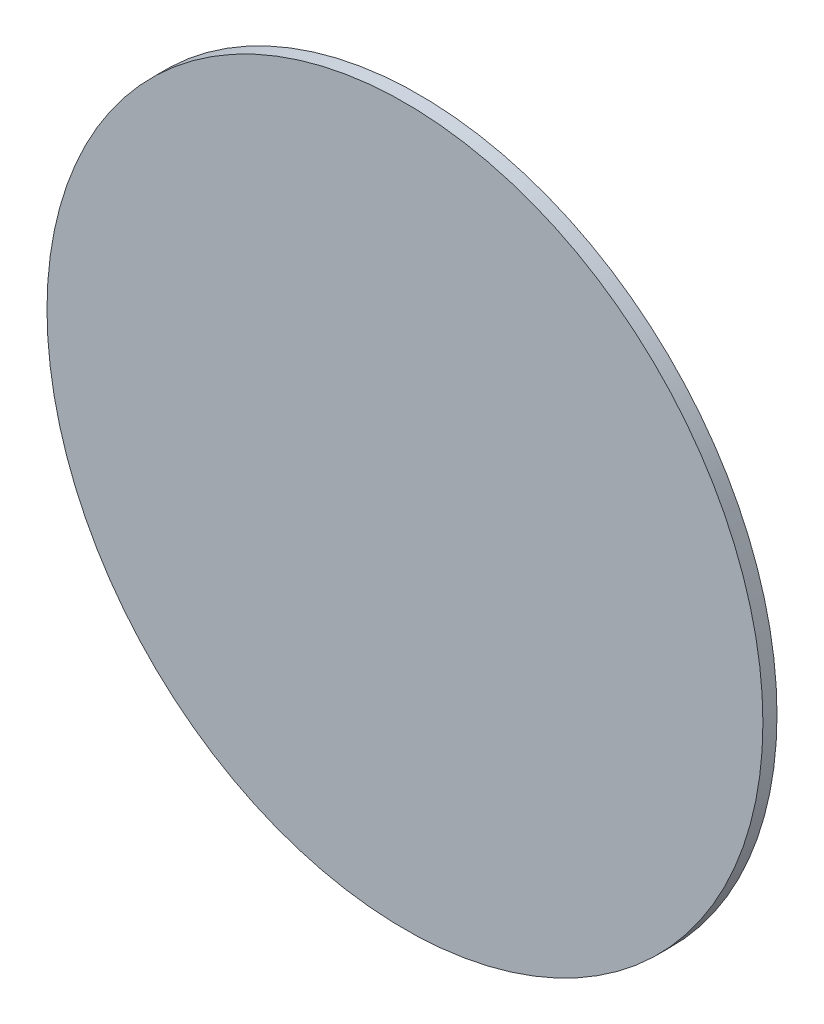
ISO-10303-21;
HEADER;
FILE_DESCRIPTION(('STEP AP214'),'2;1');
FILE_NAME('part.step','',(''),(''),'','','');
FILE_SCHEMA(('AUTOMOTIVE_DESIGN { 1 0 10303 214 1 1 1 1 }'));
ENDSEC;
DATA;
#1=APPLICATION_CONTEXT('core data for automotive mechanical design processes');
#2=APPLICATION_PROTOCOL_DEFINITION('international standard','automotive_design',2000,#1);
#3=PRODUCT_CONTEXT('',#1,'mechanical');
#4=PRODUCT('Part','Part','',(#3));
#5=PRODUCT_RELATED_PRODUCT_CATEGORY('part','',(#4));
#6=PRODUCT_DEFINITION_FORMATION('','',#4);
#7=PRODUCT_DEFINITION_CONTEXT('part definition',#1,'design');
#8=PRODUCT_DEFINITION('design','',#6,#7);
#9=PRODUCT_DEFINITION_SHAPE('','',#8);
#10=(LENGTH_UNIT() NAMED_UNIT(*) SI_UNIT(.MILLI.,.METRE.));
#11=(NAMED_UNIT(*) PLANE_ANGLE_UNIT() SI_UNIT($,.RADIAN.));
#12=(NAMED_UNIT(*) SI_UNIT($,.STERADIAN.) SOLID_ANGLE_UNIT());
#13=UNCERTAINTY_MEASURE_WITH_UNIT(LENGTH_MEASURE(1.E-05),#10,'distance_accuracy_value','');
#14=(GEOMETRIC_REPRESENTATION_CONTEXT(3) GLOBAL_UNCERTAINTY_ASSIGNED_CONTEXT((#13)) GLOBAL_UNIT_ASSIGNED_CONTEXT((#10,
#11,#12)) REPRESENTATION_CONTEXT('',''));
#15=CARTESIAN_POINT('',(0.,0.,0.));
#16=DIRECTION('',(0.,0.,1.));
#17=DIRECTION('',(1.,0.,0.));
#18=AXIS2_PLACEMENT_3D('',#15,#16,#17);
#19=CARTESIAN_POINT('',(0.,0.,1.));
#20=DIRECTION('',(0.,0.,-1.));
#21=DIRECTION('',(-1.,0.,0.));
#22=AXIS2_PLACEMENT_3D('',#19,#20,#21);
#23=CYLINDRICAL_SURFACE('',#22,25.4);
#24=CARTESIAN_POINT('',(0.,0.,1.));
#25=DIRECTION('',(0.,0.,1.));
#26=DIRECTION('',(1.,0.,0.));
#27=AXIS2_PLACEMENT_3D('',#24,#25,#26);
#28=CIRCLE('',#27,25.4);
#29=CARTESIAN_POINT('',(25.4,0.,1.));
#30=VERTEX_POINT('',#29);
#31=EDGE_CURVE('E10',#30,#30,#28,.T.);
#32=ORIENTED_EDGE('',*,*,#31,.F.);
#33=EDGE_LOOP('',(#32));
#34=FACE_BOUND('',#33,.T.);
#35=CARTESIAN_POINT('',(0.,0.,0.));
#36=DIRECTION('',(0.,0.,1.));
#37=DIRECTION('',(1.,0.,0.));
#38=AXIS2_PLACEMENT_3D('',#35,#36,#37);
#39=CIRCLE('',#38,25.4);
#40=CARTESIAN_POINT('',(25.4,0.,0.));
#41=VERTEX_POINT('',#40);
#42=EDGE_CURVE('E34',#41,#41,#39,.T.);
#43=ORIENTED_EDGE('',*,*,#42,.T.);
#44=EDGE_LOOP('',(#43));
#45=FACE_BOUND('',#44,.T.);
#46=ADVANCED_FACE('F31',(#34,#45),#23,.T.);
#47=CARTESIAN_POINT('',(0.,0.,1.));
#48=DIRECTION('',(0.,0.,1.));
#49=DIRECTION('',(1.,0.,0.));
#50=AXIS2_PLACEMENT_3D('',#47,#48,#49);
#51=PLANE('',#50);
#52=ORIENTED_EDGE('',*,*,#31,.T.);
#53=EDGE_LOOP('',(#52));
#54=FACE_BOUND('',#53,.T.);
#55=ADVANCED_FACE('F46',(#54),#51,.T.);
#56=CARTESIAN_POINT('',(0.,0.,0.));
#57=DIRECTION('',(0.,0.,1.));
#58=DIRECTION('',(1.,0.,0.));
#59=AXIS2_PLACEMENT_3D('',#56,#57,#58);
#60=PLANE('',#59);
#61=ORIENTED_EDGE('',*,*,#42,.F.);
#62=EDGE_LOOP('',(#61));
#63=FACE_BOUND('',#62,.T.);
#64=ADVANCED_FACE('F44',(#63),#60,.F.);
#65=CLOSED_SHELL('',(#46,#55,#64));
#66=MANIFOLD_SOLID_BREP('B2',#65);
#67=ADVANCED_BREP_SHAPE_REPRESENTATION('',(#18,#66),#14);
#68=SHAPE_DEFINITION_REPRESENTATION(#9,#67);
ENDSEC;
END-ISO-10303-21;
